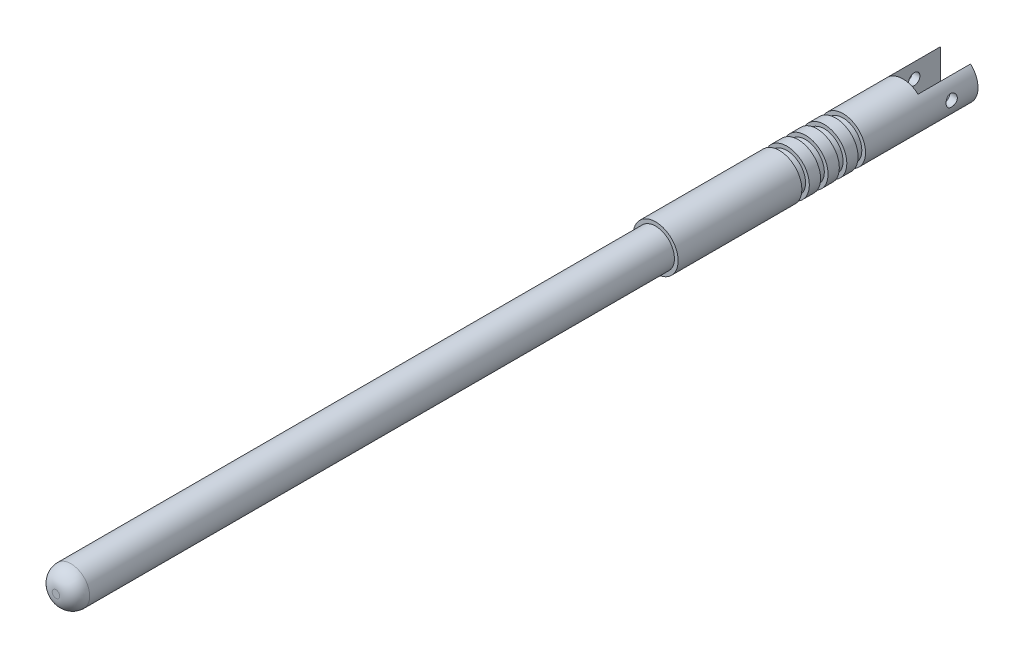
ISO-10303-21;
HEADER;
FILE_DESCRIPTION(('STEP AP214'),'2;1');
FILE_NAME('part.step','',(''),(''),'','','');
FILE_SCHEMA(('AUTOMOTIVE_DESIGN { 1 0 10303 214 1 1 1 1 }'));
ENDSEC;
DATA;
#1=APPLICATION_CONTEXT('core data for automotive mechanical design processes');
#2=APPLICATION_PROTOCOL_DEFINITION('international standard','automotive_design',2000,#1);
#3=PRODUCT_CONTEXT('',#1,'mechanical');
#4=PRODUCT('Part','Part','',(#3));
#5=PRODUCT_RELATED_PRODUCT_CATEGORY('part','',(#4));
#6=PRODUCT_DEFINITION_FORMATION('','',#4);
#7=PRODUCT_DEFINITION_CONTEXT('part definition',#1,'design');
#8=PRODUCT_DEFINITION('design','',#6,#7);
#9=PRODUCT_DEFINITION_SHAPE('','',#8);
#10=(LENGTH_UNIT() NAMED_UNIT(*) SI_UNIT(.MILLI.,.METRE.));
#11=(NAMED_UNIT(*) PLANE_ANGLE_UNIT() SI_UNIT($,.RADIAN.));
#12=(NAMED_UNIT(*) SI_UNIT($,.STERADIAN.) SOLID_ANGLE_UNIT());
#13=UNCERTAINTY_MEASURE_WITH_UNIT(LENGTH_MEASURE(1.E-05),#10,'distance_accuracy_value','');
#14=(GEOMETRIC_REPRESENTATION_CONTEXT(3) GLOBAL_UNCERTAINTY_ASSIGNED_CONTEXT((#13)) GLOBAL_UNIT_ASSIGNED_CONTEXT((#10,
#11,#12)) REPRESENTATION_CONTEXT('',''));
#15=CARTESIAN_POINT('',(0.,0.,0.));
#16=DIRECTION('',(0.,0.,1.));
#17=DIRECTION('',(1.,0.,0.));
#18=AXIS2_PLACEMENT_3D('',#15,#16,#17);
#19=CARTESIAN_POINT('',(0.,0.,15.));
#20=DIRECTION('',(0.,0.,-1.));
#21=DIRECTION('',(-1.,0.,0.));
#22=AXIS2_PLACEMENT_3D('',#19,#20,#21);
#23=CYLINDRICAL_SURFACE('',#22,3.);
#24=CARTESIAN_POINT('',(-3.,0.,4.21187914002249));
#25=CARTESIAN_POINT('',(-2.99999951607766,-0.0396951823118802,4.19871445289056));
#26=CARTESIAN_POINT('',(-2.99920522311729,-0.0782999361684681,4.18221641254789));
#27=CARTESIAN_POINT('',(-2.99636551655052,-0.152202805966226,4.14303785147214));
#28=CARTESIAN_POINT('',(-2.99431920847822,-0.187498537063075,4.1203529171197));
#29=CARTESIAN_POINT('',(-2.9894334418129,-0.253754472537291,4.06948766116593));
#30=CARTESIAN_POINT('',(-2.98659481893473,-0.284719193781647,4.04131313925472));
#31=CARTESIAN_POINT('',(-2.9806338018215,-0.341525636472115,3.98023453489045));
#32=CARTESIAN_POINT('',(-2.97751142685196,-0.367367705345278,3.9473307734438));
#33=CARTESIAN_POINT('',(-2.97145591521927,-0.413521331179031,3.87724707200592));
#34=CARTESIAN_POINT('',(-2.96852555883578,-0.433761410866465,3.8400197705991));
#35=CARTESIAN_POINT('',(-2.963367438778,-0.46770709533146,3.76264994342208));
#36=CARTESIAN_POINT('',(-2.96113964824049,-0.481412949961047,3.72250752918597));
#37=CARTESIAN_POINT('',(-2.95774732100668,-0.501835257590522,3.6406136233411));
#38=CARTESIAN_POINT('',(-2.95657842629934,-0.508580374443533,3.59886947079098));
#39=CARTESIAN_POINT('',(-2.95547262624129,-0.51496852895699,3.51482663466774));
#40=CARTESIAN_POINT('',(-2.95553562108278,-0.514612141981783,3.47252799629658));
#41=CARTESIAN_POINT('',(-2.95687456262065,-0.506860247421461,3.38914488625412));
#42=CARTESIAN_POINT('',(-2.95813512358253,-0.499554026355907,3.34805182036483));
#43=CARTESIAN_POINT('',(-2.96165288461993,-0.478254718260954,3.2676821675055));
#44=CARTESIAN_POINT('',(-2.96391013352712,-0.464261303596828,3.22840566964047));
#45=CARTESIAN_POINT('',(-2.96908763603957,-0.429907281060499,3.152553176333));
#46=CARTESIAN_POINT('',(-2.9720111764563,-0.409514912652045,3.11599180171042));
#47=CARTESIAN_POINT('',(-2.97805573588648,-0.362951099023721,3.04677110845069));
#48=CARTESIAN_POINT('',(-2.98117677390649,-0.336779096984985,3.01411216624746));
#49=CARTESIAN_POINT('',(-2.98714189306465,-0.278990644092407,2.9531916192855));
#50=CARTESIAN_POINT('',(-2.98998194898651,-0.24730921003369,2.9249911938824));
#51=CARTESIAN_POINT('',(-2.99481054742343,-0.179608552433021,2.87429967683179));
#52=CARTESIAN_POINT('',(-2.99679914140029,-0.143589591217036,2.85180824017018));
#53=CARTESIAN_POINT('',(-2.99945068618497,-0.0685144135895478,2.81334503474394));
#54=CARTESIAN_POINT('',(-3.00012338214234,-0.0294827672949382,2.79732604070926));
#55=CARTESIAN_POINT('',(-2.99983908759758,0.0507045205579571,2.77205298123447));
#56=CARTESIAN_POINT('',(-2.99888235921979,0.0918598194530102,2.76279782804239));
#57=CARTESIAN_POINT('',(-2.99521585597383,0.174199035241648,2.75142528371647));
#58=CARTESIAN_POINT('',(-2.99254259684448,0.215364900843016,2.74916479357001));
#59=CARTESIAN_POINT('',(-2.98550950445478,0.297366095055782,2.751384626159));
#60=CARTESIAN_POINT('',(-2.9811496670449,0.338201422853698,2.75586496547913));
#61=CARTESIAN_POINT('',(-2.97094562157494,0.418476634247664,2.77137035636871));
#62=CARTESIAN_POINT('',(-2.96509917227368,0.45791430751371,2.78240532366598));
#63=CARTESIAN_POINT('',(-2.95228814025356,0.534319230666885,2.81064815841938));
#64=CARTESIAN_POINT('',(-2.94532335780499,0.571286037594038,2.82785712920618));
#65=CARTESIAN_POINT('',(-2.93052110778936,0.642984602463689,2.86859472068403));
#66=CARTESIAN_POINT('',(-2.92266290129508,0.677607576322122,2.89230727634627));
#67=CARTESIAN_POINT('',(-2.90687497206096,0.742423474060197,2.94515460022031));
#68=CARTESIAN_POINT('',(-2.89894523384199,0.772615413428582,2.97429057018363));
#69=CARTESIAN_POINT('',(-2.88348375526722,0.82848282456419,3.03806312272153));
#70=CARTESIAN_POINT('',(-2.87596687336067,0.85402687570317,3.07281876818627));
#71=CARTESIAN_POINT('',(-2.86226755404448,0.898875191205323,3.14638793849942));
#72=CARTESIAN_POINT('',(-2.85608489964706,0.9181804704455,3.18520080198889));
#73=CARTESIAN_POINT('',(-2.84582088029416,0.949510762412032,3.26486601253158));
#74=CARTESIAN_POINT('',(-2.84169376949753,0.961695425473673,3.30564946617797));
#75=CARTESIAN_POINT('',(-2.83577921392906,0.979000463604915,3.3888481257989));
#76=CARTESIAN_POINT('',(-2.83399084920814,0.984123616372407,3.43126268341408));
#77=CARTESIAN_POINT('',(-2.83298176289436,0.987023642043795,3.51424381464208));
#78=CARTESIAN_POINT('',(-2.83363729948793,0.9851545363459,3.55479692060054));
#79=CARTESIAN_POINT('',(-2.83717161411528,0.974928694955779,3.63497373825298));
#80=CARTESIAN_POINT('',(-2.84005032040789,0.966572168611042,3.67459747989481));
#81=CARTESIAN_POINT('',(-2.84770153153481,0.943788770588101,3.75144128278852));
#82=CARTESIAN_POINT('',(-2.85245573461855,0.929420483964015,3.78868064602406));
#83=CARTESIAN_POINT('',(-2.8634162309436,0.895081550472223,3.86024615072166));
#84=CARTESIAN_POINT('',(-2.86962282229114,0.875109753302617,3.89457169214097));
#85=CARTESIAN_POINT('',(-2.88324642216272,0.829148540852894,3.96092664813493));
#86=CARTESIAN_POINT('',(-2.89070394739479,0.802937646781916,3.99279428924806));
#87=CARTESIAN_POINT('',(-2.90599263675732,0.745709734301829,4.05177411439199));
#88=CARTESIAN_POINT('',(-2.91382388981771,0.714691567997813,4.07888515932332));
#89=CARTESIAN_POINT('',(-2.92955404998417,0.647268762553988,4.1286806767729));
#90=CARTESIAN_POINT('',(-2.93744306014567,0.610697914790163,4.15114384709847));
#91=CARTESIAN_POINT('',(-2.9523288905426,0.534110527106948,4.18956929348355));
#92=CARTESIAN_POINT('',(-2.95932564938624,0.494093750405726,4.20553112238065));
#93=CARTESIAN_POINT('',(-2.97185920296285,0.412022332668587,4.2303175304511));
#94=CARTESIAN_POINT('',(-2.97740661735805,0.369985350305045,4.23919506443588));
#95=CARTESIAN_POINT('',(-2.98675311750144,0.28484185189493,4.24963800648088));
#96=CARTESIAN_POINT('',(-2.99055368753353,0.241736276775566,4.25120963271876));
#97=CARTESIAN_POINT('',(-2.99564788440698,0.165048435210588,4.24739430441546));
#98=CARTESIAN_POINT('',(-2.9973049259054,0.13141227969311,4.24343153979353));
#99=CARTESIAN_POINT('',(-2.99948115987526,0.0649461717072543,4.23099945842938));
#100=CARTESIAN_POINT('',(-3.00000039152717,0.0321161915167337,4.22253029687737));
#101=CARTESIAN_POINT('',(-3.,0.,4.21187914002249));
#102=B_SPLINE_CURVE_WITH_KNOTS('',3,(#24,#25,#26,#27,#28,#29,#30,#31,#32,#33,#34,#35,#36,#37,
#38,#39,#40,#41,#42,#43,#44,#45,#46,#47,#48,#49,#50,#51,#52,#53,#54,#55,#56,#57,#58,#59,#60,#61,
#62,#63,#64,#65,#66,#67,#68,#69,#70,#71,#72,#73,#74,#75,#76,#77,#78,#79,#80,#81,#82,#83,#84,#85,
#86,#87,#88,#89,#90,#91,#92,#93,#94,#95,#96,#97,#98,#99,#100,#101),.UNSPECIFIED.,.T.,.F.,(4,2,2,
2,2,2,2,2,2,2,2,2,2,2,2,2,2,2,2,2,2,2,2,2,2,2,2,2,2,2,2,2,2,2,2,2,2,2,4),(0.,0.125338767230438,
0.250767183835606,0.376063798248049,0.501351911920008,0.628171767355649,0.754986773135899,
0.881277453768808,1.00755790236335,1.13223759558697,1.25692339803793,1.38223812435334,
1.5075649289549,1.63448495699069,1.76139731297903,1.8873661813037,2.01331478702063,
2.1366690633913,2.2600236432553,2.38356530876347,2.50712906289873,2.6346309553981,
2.76216113420998,2.89287192481439,3.02356144164389,3.15119563345571,3.27877960506184,
3.39999342676328,3.52120333708672,3.64125858946473,3.7613385051236,3.88657206091204,
4.01183556654947,4.14212596794229,4.2724253291991,4.40174133763351,4.53094726292053,
4.63235862420106,4.73376649332777),.UNSPECIFIED.);
#103=CARTESIAN_POINT('',(-3.,0.,4.21187914002249));
#104=VERTEX_POINT('',#103);
#105=EDGE_CURVE('E105',#104,#104,#102,.T.);
#106=ORIENTED_EDGE('',*,*,#105,.T.);
#107=EDGE_LOOP('',(#106));
#108=FACE_BOUND('',#107,.T.);
#109=CARTESIAN_POINT('',(2.99069756244244,0.236067977499789,2.75));
#110=CARTESIAN_POINT('',(2.99393630665962,0.19503062294816,2.75000088477695));
#111=CARTESIAN_POINT('',(2.99632406088275,0.153916140381382,2.75337882080404));
#112=CARTESIAN_POINT('',(2.99939387290241,0.0727255596170461,2.76684667900384));
#113=CARTESIAN_POINT('',(3.00007532111909,0.0326498375765347,2.77693899826876));
#114=CARTESIAN_POINT('',(2.99991139748529,-0.045274253758378,2.80355144445856));
#115=CARTESIAN_POINT('',(2.99906695367447,-0.0831239624472268,2.82006765960908));
#116=CARTESIAN_POINT('',(2.99618332619538,-0.15556848029812,2.85905271339875));
#117=CARTESIAN_POINT('',(2.9941440903337,-0.190163147189995,2.88152181206071));
#118=CARTESIAN_POINT('',(2.98928168526858,-0.255500545505233,2.93203645918274));
#119=CARTESIAN_POINT('',(2.98645089375468,-0.286201378186058,2.96013543485419));
#120=CARTESIAN_POINT('',(2.98051587625903,-0.342533515563384,3.02100079876274));
#121=CARTESIAN_POINT('',(2.97741162223346,-0.368164299445367,3.05376766590916));
#122=CARTESIAN_POINT('',(2.97137692211172,-0.414085719559897,3.12372617916445));
#123=CARTESIAN_POINT('',(2.96845062060682,-0.434271703570968,3.1609869714549));
#124=CARTESIAN_POINT('',(2.96330451373372,-0.468103511267324,3.23841412410749));
#125=CARTESIAN_POINT('',(2.96108467740944,-0.481749621531802,3.27858035706357));
#126=CARTESIAN_POINT('',(2.95771105786448,-0.502047632151077,3.36050618248677));
#127=CARTESIAN_POINT('',(2.9565527711905,-0.508729095643278,3.40225825397426));
#128=CARTESIAN_POINT('',(2.95546883314705,-0.514989887097744,3.48630564199189));
#129=CARTESIAN_POINT('',(2.95554307754874,-0.514569815600421,3.52860091228423));
#130=CARTESIAN_POINT('',(2.95690326674875,-0.506693249755723,3.61196808234772));
#131=CARTESIAN_POINT('',(2.95817388402123,-0.499325761577035,3.65304868799473));
#132=CARTESIAN_POINT('',(2.96170920939307,-0.477907149936521,3.73338356843314));
#133=CARTESIAN_POINT('',(2.96397396902301,-0.463855680012732,3.77263774843656));
#134=CARTESIAN_POINT('',(2.96916305654992,-0.429388422832689,3.84843981891194));
#135=CARTESIAN_POINT('',(2.97209071007114,-0.408940340383742,3.88497278505468));
#136=CARTESIAN_POINT('',(2.97813907237946,-0.362270095614246,3.95412777628841));
#137=CARTESIAN_POINT('',(2.98125979952838,-0.33604738350207,3.98674942853351));
#138=CARTESIAN_POINT('',(2.98721941321197,-0.278164283096547,4.04758568077872));
#139=CARTESIAN_POINT('',(2.99005422594272,-0.246439183606034,4.07573917891916));
#140=CARTESIAN_POINT('',(2.9948677583643,-0.178659443487224,4.12632991424384));
#141=CARTESIAN_POINT('',(2.99684653034378,-0.142605067471574,4.14876750053278));
#142=CARTESIAN_POINT('',(2.99947461066354,-0.0674732045516595,4.18711567307646));
#143=CARTESIAN_POINT('',(3.00013383807447,-0.0284205819936907,4.20307423258931));
#144=CARTESIAN_POINT('',(2.99982062168798,0.0517975336617581,4.22822425378961));
#145=CARTESIAN_POINT('',(2.99884844005921,0.0929626862435434,4.23741680243855));
#146=CARTESIAN_POINT('',(2.99515105661623,0.175310979678907,4.24866559713729));
#147=CARTESIAN_POINT('',(2.99246234095656,0.216476318024441,4.25086480453124));
#148=CARTESIAN_POINT('',(2.98539968111012,0.298466052670951,4.24852427465946));
#149=CARTESIAN_POINT('',(2.98102573114819,0.33929044780305,4.24398451429962));
#150=CARTESIAN_POINT('',(2.97079545426362,0.419540617004002,4.22836256436016));
#151=CARTESIAN_POINT('',(2.96493666188617,0.458963939341217,4.21726945231784));
#152=CARTESIAN_POINT('',(2.95210459158009,0.53533119065314,4.18891325141342));
#153=CARTESIAN_POINT('',(2.94513111397027,0.572274673710418,4.1716490563967));
#154=CARTESIAN_POINT('',(2.93031533294872,0.64392038683909,4.13080160530971));
#155=CARTESIAN_POINT('',(2.92245238918688,0.678513297866016,4.10703407969236));
#156=CARTESIAN_POINT('',(2.90666071992588,0.743260369814846,4.0540809942509));
#157=CARTESIAN_POINT('',(2.89873198024063,0.773413545770085,4.02489423539351));
#158=CARTESIAN_POINT('',(2.88328004742477,0.82918980067454,3.9610289506616));
#159=CARTESIAN_POINT('',(2.87577178208263,0.854682035017659,3.92623221167625));
#160=CARTESIAN_POINT('',(2.86209597494815,0.899419901259911,3.85258947725756));
#161=CARTESIAN_POINT('',(2.85592821095619,0.918666568676635,3.81374415449361));
#162=CARTESIAN_POINT('',(2.84570003141278,0.949871750893736,3.73403454054329));
#163=CARTESIAN_POINT('',(2.84159330020445,0.961991607702354,3.69323956928203));
#164=CARTESIAN_POINT('',(2.83572149819913,0.979166987422673,3.61003008643096));
#165=CARTESIAN_POINT('',(2.83395551256457,0.984225270262522,3.56761621423075));
#166=CARTESIAN_POINT('',(2.83298947472051,0.987001406788516,3.48464684842205));
#167=CARTESIAN_POINT('',(2.8336657977492,0.985072901242804,3.44410421481021));
#168=CARTESIAN_POINT('',(2.83723917496324,0.974732394782071,3.3639584730545));
#169=CARTESIAN_POINT('',(2.84013615804815,0.966320601446982,3.324355334872));
#170=CARTESIAN_POINT('',(2.8478207511757,0.943429707976077,3.24754994170407));
#171=CARTESIAN_POINT('',(2.85259063759159,0.929007410006668,3.21032887785913));
#172=CARTESIAN_POINT('',(2.86357826489319,0.894564107378878,3.13880867812077));
#173=CARTESIAN_POINT('',(2.86979628510538,0.874542022443337,3.10451010768449));
#174=CARTESIAN_POINT('',(2.88343883880841,0.828480730593314,3.03821480596159));
#175=CARTESIAN_POINT('',(2.89090375745372,0.802219794183629,3.00638048903686));
#176=CARTESIAN_POINT('',(2.90620263636258,0.744892825489461,2.9474717341458));
#177=CARTESIAN_POINT('',(2.91403672533085,0.713825108657029,2.92039897201257));
#178=CARTESIAN_POINT('',(2.92976774713608,0.646303939480038,2.87068788914522));
#179=CARTESIAN_POINT('',(2.93765451802537,0.609684044450186,2.8482719107454));
#180=CARTESIAN_POINT('',(2.95252548958293,0.53302304109773,2.80996269954897));
#181=CARTESIAN_POINT('',(2.95951020114433,0.49298389085239,2.79406576341032));
#182=CARTESIAN_POINT('',(2.97108738750211,0.416990437759085,2.77124200443547));
#183=CARTESIAN_POINT('',(2.97588291574056,0.381367312582405,2.76330558148212));
#184=CARTESIAN_POINT('',(2.98424365716021,0.309205808260737,2.75268457868788));
#185=CARTESIAN_POINT('',(2.98780905486189,0.272667567266496,2.74999921090251));
#186=CARTESIAN_POINT('',(2.99069756244244,0.236067977499789,2.75));
#187=B_SPLINE_CURVE_WITH_KNOTS('',3,(#109,#110,#111,#112,#113,#114,#115,#116,#117,#118,#119,
#120,#121,#122,#123,#124,#125,#126,#127,#128,#129,#130,#131,#132,#133,#134,#135,#136,#137,#138,
#139,#140,#141,#142,#143,#144,#145,#146,#147,#148,#149,#150,#151,#152,#153,#154,#155,#156,#157,
#158,#159,#160,#161,#162,#163,#164,#165,#166,#167,#168,#169,#170,#171,#172,#173,#174,#175,#176,
#177,#178,#179,#180,#181,#182,#183,#184,#185,#186),.UNSPECIFIED.,.T.,.F.,(4,2,2,2,2,2,2,2,2,2,2,
2,2,2,2,2,2,2,2,2,2,2,2,2,2,2,2,2,2,2,2,2,2,2,2,2,2,2,4),(0.,0.123363701901307,0.24677146934905,
0.370104206090382,0.493442330911974,0.618011663022439,0.742593784726557,0.869422863488141,
0.996246384053896,1.12252935158483,1.24880164006594,1.37347787066641,1.49816056452203,
1.62348320203825,1.74881777644962,1.87574100539723,2.00265648052916,2.12861428923167,
2.25455185835828,2.37789782582978,2.50124421600277,2.62479676976392,2.74837148119522,
2.8758943781183,3.00344552383418,3.13415893861064,3.26485066996219,3.39245682208083,
3.52001308694992,3.64120525468809,3.76239354229354,3.88246162025464,4.00255287702174,
4.12780845164633,4.25310802223932,4.3834508342647,4.51371949813763,4.62375920683571,
4.73378240231265),.UNSPECIFIED.);
#188=CARTESIAN_POINT('',(2.99069756244244,0.236067977499789,2.75));
#189=VERTEX_POINT('',#188);
#190=EDGE_CURVE('E180',#189,#189,#187,.T.);
#191=ORIENTED_EDGE('',*,*,#190,.T.);
#192=EDGE_LOOP('',(#191));
#193=FACE_BOUND('',#192,.T.);
#194=CARTESIAN_POINT('',(0.,0.,15.));
#195=DIRECTION('',(0.,0.,1.));
#196=DIRECTION('',(1.,0.,0.));
#197=AXIS2_PLACEMENT_3D('',#194,#195,#196);
#198=CIRCLE('',#197,3.);
#199=CARTESIAN_POINT('',(3.,0.,15.));
#200=VERTEX_POINT('',#199);
#201=EDGE_CURVE('E111',#200,#200,#198,.T.);
#202=ORIENTED_EDGE('',*,*,#201,.F.);
#203=EDGE_LOOP('',(#202));
#204=FACE_BOUND('',#203,.T.);
#205=CARTESIAN_POINT('',(0.,0.,7.));
#206=DIRECTION('',(0.,0.,-1.));
#207=DIRECTION('',(-1.,0.,0.));
#208=AXIS2_PLACEMENT_3D('',#205,#206,#207);
#209=CIRCLE('',#208,3.);
#210=CARTESIAN_POINT('',(-2.,2.23606797749979,7.));
#211=VERTEX_POINT('',#210);
#212=CARTESIAN_POINT('',(2.,2.23606797749979,7.));
#213=VERTEX_POINT('',#212);
#214=EDGE_CURVE('E86',#211,#213,#209,.T.);
#215=ORIENTED_EDGE('',*,*,#214,.F.);
#216=DIRECTION('',(0.,0.,-1.));
#217=VECTOR('',#216,1.);
#218=CARTESIAN_POINT('',(-2.,2.23606797749979,15.));
#219=LINE('',#218,#217);
#220=CARTESIAN_POINT('',(-2.,2.23606797749979,0.));
#221=VERTEX_POINT('',#220);
#222=EDGE_CURVE('E61',#211,#221,#219,.T.);
#223=ORIENTED_EDGE('',*,*,#222,.T.);
#224=CARTESIAN_POINT('',(0.,0.,0.));
#225=DIRECTION('',(0.,0.,1.));
#226=DIRECTION('',(1.,0.,0.));
#227=AXIS2_PLACEMENT_3D('',#224,#225,#226);
#228=CIRCLE('',#227,3.);
#229=CARTESIAN_POINT('',(2.,2.23606797749979,0.));
#230=VERTEX_POINT('',#229);
#231=EDGE_CURVE('E110',#221,#230,#228,.T.);
#232=ORIENTED_EDGE('',*,*,#231,.T.);
#233=DIRECTION('',(0.,0.,-1.));
#234=VECTOR('',#233,1.);
#235=CARTESIAN_POINT('',(2.,2.23606797749979,15.));
#236=LINE('',#235,#234);
#237=EDGE_CURVE('E53',#230,#213,#236,.F.);
#238=ORIENTED_EDGE('',*,*,#237,.T.);
#239=EDGE_LOOP('',(#215,#223,#232,#238));
#240=FACE_BOUND('',#239,.T.);
#241=ADVANCED_FACE('F38',(#108,#193,#204,#240),#23,.T.);
#242=CARTESIAN_POINT('',(0.,0.,15.));
#243=DIRECTION('',(0.,0.,1.));
#244=DIRECTION('',(1.,0.,0.));
#245=AXIS2_PLACEMENT_3D('',#242,#243,#244);
#246=PLANE('',#245);
#247=CARTESIAN_POINT('',(0.,0.,15.));
#248=DIRECTION('',(0.,0.,1.));
#249=DIRECTION('',(1.,0.,0.));
#250=AXIS2_PLACEMENT_3D('',#247,#248,#249);
#251=CIRCLE('',#250,2.5);
#252=CARTESIAN_POINT('',(2.5,0.,15.));
#253=VERTEX_POINT('',#252);
#254=EDGE_CURVE('E118',#253,#253,#251,.T.);
#255=ORIENTED_EDGE('',*,*,#254,.F.);
#256=EDGE_LOOP('',(#255));
#257=FACE_BOUND('',#256,.T.);
#258=ORIENTED_EDGE('',*,*,#201,.T.);
#259=EDGE_LOOP('',(#258));
#260=FACE_BOUND('',#259,.T.);
#261=ADVANCED_FACE('F214',(#257,#260),#246,.T.);
#262=CARTESIAN_POINT('',(0.,0.,0.));
#263=DIRECTION('',(0.,0.,1.));
#264=DIRECTION('',(1.,0.,0.));
#265=AXIS2_PLACEMENT_3D('',#262,#263,#264);
#266=PLANE('',#265);
#267=ORIENTED_EDGE('',*,*,#231,.F.);
#268=DIRECTION('',(0.,1.,0.));
#269=VECTOR('',#268,1.);
#270=CARTESIAN_POINT('',(-2.,-2.,0.));
#271=LINE('',#270,#269);
#272=CARTESIAN_POINT('',(-2.,-2.,0.));
#273=VERTEX_POINT('',#272);
#274=EDGE_CURVE('E102',#273,#221,#271,.T.);
#275=ORIENTED_EDGE('',*,*,#274,.F.);
#276=DIRECTION('',(-1.,0.,0.));
#277=VECTOR('',#276,1.);
#278=CARTESIAN_POINT('',(2.,-2.,0.));
#279=LINE('',#278,#277);
#280=CARTESIAN_POINT('',(2.,-2.,0.));
#281=VERTEX_POINT('',#280);
#282=EDGE_CURVE('E104',#281,#273,#279,.T.);
#283=ORIENTED_EDGE('',*,*,#282,.F.);
#284=DIRECTION('',(0.,1.,0.));
#285=VECTOR('',#284,1.);
#286=CARTESIAN_POINT('',(2.,0.,0.));
#287=LINE('',#286,#285);
#288=EDGE_CURVE('E92',#281,#230,#287,.T.);
#289=ORIENTED_EDGE('',*,*,#288,.T.);
#290=EDGE_LOOP('',(#267,#275,#283,#289));
#291=FACE_BOUND('',#290,.T.);
#292=ADVANCED_FACE('F205',(#291),#266,.F.);
#293=CARTESIAN_POINT('',(0.,0.,7.));
#294=DIRECTION('',(0.,0.,-1.));
#295=DIRECTION('',(-1.,0.,0.));
#296=AXIS2_PLACEMENT_3D('',#293,#294,#295);
#297=PLANE('',#296);
#298=ORIENTED_EDGE('',*,*,#214,.T.);
#299=DIRECTION('',(0.,-1.,0.));
#300=VECTOR('',#299,1.);
#301=CARTESIAN_POINT('',(2.,3.18320258421781,7.));
#302=LINE('',#301,#300);
#303=CARTESIAN_POINT('',(2.,-2.,7.));
#304=VERTEX_POINT('',#303);
#305=EDGE_CURVE('E80',#213,#304,#302,.T.);
#306=ORIENTED_EDGE('',*,*,#305,.T.);
#307=DIRECTION('',(-1.,0.,0.));
#308=VECTOR('',#307,1.);
#309=CARTESIAN_POINT('',(2.,-2.,7.));
#310=LINE('',#309,#308);
#311=CARTESIAN_POINT('',(-2.,-2.,7.));
#312=VERTEX_POINT('',#311);
#313=EDGE_CURVE('E84',#304,#312,#310,.T.);
#314=ORIENTED_EDGE('',*,*,#313,.T.);
#315=DIRECTION('',(0.,1.,0.));
#316=VECTOR('',#315,1.);
#317=CARTESIAN_POINT('',(-2.,-2.,7.));
#318=LINE('',#317,#316);
#319=EDGE_CURVE('E87',#312,#211,#318,.T.);
#320=ORIENTED_EDGE('',*,*,#319,.T.);
#321=EDGE_LOOP('',(#298,#306,#314,#320));
#322=FACE_BOUND('',#321,.T.);
#323=ADVANCED_FACE('F82',(#322),#297,.T.);
#324=CARTESIAN_POINT('',(-2.,-2.,7.));
#325=DIRECTION('',(-1.,0.,0.));
#326=DIRECTION('',(0.,0.,1.));
#327=AXIS2_PLACEMENT_3D('',#324,#325,#326);
#328=PLANE('',#327);
#329=CARTESIAN_POINT('',(-2.,0.236067977499789,3.5));
#330=DIRECTION('',(-1.,0.,0.));
#331=DIRECTION('',(0.,0.,1.));
#332=AXIS2_PLACEMENT_3D('',#329,#330,#331);
#333=CIRCLE('',#332,0.75);
#334=CARTESIAN_POINT('',(-2.,0.236067977499789,4.25));
#335=VERTEX_POINT('',#334);
#336=EDGE_CURVE('E121',#335,#335,#333,.T.);
#337=ORIENTED_EDGE('',*,*,#336,.T.);
#338=EDGE_LOOP('',(#337));
#339=FACE_BOUND('',#338,.T.);
#340=ORIENTED_EDGE('',*,*,#319,.F.);
#341=DIRECTION('',(0.,0.,-1.));
#342=VECTOR('',#341,1.);
#343=CARTESIAN_POINT('',(-2.,-2.,7.));
#344=LINE('',#343,#342);
#345=EDGE_CURVE('E96',#312,#273,#344,.T.);
#346=ORIENTED_EDGE('',*,*,#345,.T.);
#347=ORIENTED_EDGE('',*,*,#274,.T.);
#348=ORIENTED_EDGE('',*,*,#222,.F.);
#349=EDGE_LOOP('',(#340,#346,#347,#348));
#350=FACE_BOUND('',#349,.T.);
#351=ADVANCED_FACE('F204',(#339,#350),#328,.F.);
#352=CARTESIAN_POINT('',(2.,3.18320258421781,7.));
#353=DIRECTION('',(1.,0.,0.));
#354=DIRECTION('',(0.,1.,0.));
#355=AXIS2_PLACEMENT_3D('',#352,#353,#354);
#356=PLANE('',#355);
#357=CARTESIAN_POINT('',(2.,0.236067977499789,3.5));
#358=DIRECTION('',(1.,0.,0.));
#359=DIRECTION('',(0.,1.,0.));
#360=AXIS2_PLACEMENT_3D('',#357,#358,#359);
#361=CIRCLE('',#360,0.75);
#362=CARTESIAN_POINT('',(2.,0.986067977499789,3.5));
#363=VERTEX_POINT('',#362);
#364=EDGE_CURVE('E119',#363,#363,#361,.T.);
#365=ORIENTED_EDGE('',*,*,#364,.T.);
#366=EDGE_LOOP('',(#365));
#367=FACE_BOUND('',#366,.T.);
#368=ORIENTED_EDGE('',*,*,#288,.F.);
#369=DIRECTION('',(0.,0.,-1.));
#370=VECTOR('',#369,1.);
#371=CARTESIAN_POINT('',(2.,-2.,7.));
#372=LINE('',#371,#370);
#373=EDGE_CURVE('E90',#304,#281,#372,.T.);
#374=ORIENTED_EDGE('',*,*,#373,.F.);
#375=ORIENTED_EDGE('',*,*,#305,.F.);
#376=ORIENTED_EDGE('',*,*,#237,.F.);
#377=EDGE_LOOP('',(#368,#374,#375,#376));
#378=FACE_BOUND('',#377,.T.);
#379=ADVANCED_FACE('F91',(#367,#378),#356,.F.);
#380=CARTESIAN_POINT('',(2.,-2.,7.));
#381=DIRECTION('',(0.,-1.,0.));
#382=DIRECTION('',(0.,0.,-1.));
#383=AXIS2_PLACEMENT_3D('',#380,#381,#382);
#384=PLANE('',#383);
#385=ORIENTED_EDGE('',*,*,#282,.T.);
#386=ORIENTED_EDGE('',*,*,#345,.F.);
#387=ORIENTED_EDGE('',*,*,#313,.F.);
#388=ORIENTED_EDGE('',*,*,#373,.T.);
#389=EDGE_LOOP('',(#385,#386,#387,#388));
#390=FACE_BOUND('',#389,.T.);
#391=ADVANCED_FACE('F98',(#390),#384,.F.);
#392=CARTESIAN_POINT('',(-5.,0.236067977499789,3.5));
#393=DIRECTION('',(1.,0.,0.));
#394=DIRECTION('',(0.,0.,-1.));
#395=AXIS2_PLACEMENT_3D('',#392,#393,#394);
#396=CYLINDRICAL_SURFACE('',#395,0.75);
#397=ORIENTED_EDGE('',*,*,#364,.F.);
#398=EDGE_LOOP('',(#397));
#399=FACE_BOUND('',#398,.T.);
#400=ORIENTED_EDGE('',*,*,#190,.F.);
#401=EDGE_LOOP('',(#400));
#402=FACE_BOUND('',#401,.T.);
#403=ADVANCED_FACE('F198',(#399,#402),#396,.F.);
#404=ORIENTED_EDGE('',*,*,#336,.F.);
#405=EDGE_LOOP('',(#404));
#406=FACE_BOUND('',#405,.T.);
#407=ORIENTED_EDGE('',*,*,#105,.F.);
#408=EDGE_LOOP('',(#407));
#409=FACE_BOUND('',#408,.T.);
#410=ADVANCED_FACE('F192',(#406,#409),#396,.F.);
#411=CARTESIAN_POINT('',(0.,0.,16.));
#412=DIRECTION('',(0.,0.,-1.));
#413=DIRECTION('',(-1.,0.,0.));
#414=AXIS2_PLACEMENT_3D('',#411,#412,#413);
#415=CYLINDRICAL_SURFACE('',#414,2.5);
#416=CARTESIAN_POINT('',(0.,0.,16.));
#417=DIRECTION('',(0.,0.,1.));
#418=DIRECTION('',(1.,0.,0.));
#419=AXIS2_PLACEMENT_3D('',#416,#417,#418);
#420=CIRCLE('',#419,2.5);
#421=CARTESIAN_POINT('',(2.5,0.,16.));
#422=VERTEX_POINT('',#421);
#423=EDGE_CURVE('E122',#422,#422,#420,.T.);
#424=ORIENTED_EDGE('',*,*,#423,.F.);
#425=EDGE_LOOP('',(#424));
#426=FACE_BOUND('',#425,.T.);
#427=ORIENTED_EDGE('',*,*,#254,.T.);
#428=EDGE_LOOP('',(#427));
#429=FACE_BOUND('',#428,.T.);
#430=ADVANCED_FACE('F197',(#426,#429),#415,.T.);
#431=CARTESIAN_POINT('',(0.,0.,17.5));
#432=DIRECTION('',(0.,0.,-1.));
#433=DIRECTION('',(-1.,0.,0.));
#434=AXIS2_PLACEMENT_3D('',#431,#432,#433);
#435=CYLINDRICAL_SURFACE('',#434,3.);
#436=CARTESIAN_POINT('',(0.,0.,17.5));
#437=DIRECTION('',(0.,0.,1.));
#438=DIRECTION('',(1.,0.,0.));
#439=AXIS2_PLACEMENT_3D('',#436,#437,#438);
#440=CIRCLE('',#439,3.);
#441=CARTESIAN_POINT('',(3.,0.,17.5));
#442=VERTEX_POINT('',#441);
#443=EDGE_CURVE('E169',#442,#442,#440,.T.);
#444=ORIENTED_EDGE('',*,*,#443,.F.);
#445=EDGE_LOOP('',(#444));
#446=FACE_BOUND('',#445,.T.);
#447=CARTESIAN_POINT('',(0.,0.,16.));
#448=DIRECTION('',(0.,0.,1.));
#449=DIRECTION('',(1.,0.,0.));
#450=AXIS2_PLACEMENT_3D('',#447,#448,#449);
#451=CIRCLE('',#450,3.);
#452=CARTESIAN_POINT('',(3.,0.,16.));
#453=VERTEX_POINT('',#452);
#454=EDGE_CURVE('E166',#453,#453,#451,.T.);
#455=ORIENTED_EDGE('',*,*,#454,.T.);
#456=EDGE_LOOP('',(#455));
#457=FACE_BOUND('',#456,.T.);
#458=ADVANCED_FACE('F255',(#446,#457),#435,.T.);
#459=CARTESIAN_POINT('',(0.,0.,17.5));
#460=DIRECTION('',(0.,0.,1.));
#461=DIRECTION('',(1.,0.,0.));
#462=AXIS2_PLACEMENT_3D('',#459,#460,#461);
#463=PLANE('',#462);
#464=CARTESIAN_POINT('',(0.,0.,17.5));
#465=DIRECTION('',(0.,0.,1.));
#466=DIRECTION('',(1.,0.,0.));
#467=AXIS2_PLACEMENT_3D('',#464,#465,#466);
#468=CIRCLE('',#467,2.5);
#469=CARTESIAN_POINT('',(2.5,0.,17.5));
#470=VERTEX_POINT('',#469);
#471=EDGE_CURVE('E157',#470,#470,#468,.T.);
#472=ORIENTED_EDGE('',*,*,#471,.F.);
#473=EDGE_LOOP('',(#472));
#474=FACE_BOUND('',#473,.T.);
#475=ORIENTED_EDGE('',*,*,#443,.T.);
#476=EDGE_LOOP('',(#475));
#477=FACE_BOUND('',#476,.T.);
#478=ADVANCED_FACE('F263',(#474,#477),#463,.T.);
#479=CARTESIAN_POINT('',(0.,0.,16.));
#480=DIRECTION('',(0.,0.,1.));
#481=DIRECTION('',(1.,0.,0.));
#482=AXIS2_PLACEMENT_3D('',#479,#480,#481);
#483=PLANE('',#482);
#484=ORIENTED_EDGE('',*,*,#423,.T.);
#485=EDGE_LOOP('',(#484));
#486=FACE_BOUND('',#485,.T.);
#487=ORIENTED_EDGE('',*,*,#454,.F.);
#488=EDGE_LOOP('',(#487));
#489=FACE_BOUND('',#488,.T.);
#490=ADVANCED_FACE('F272',(#486,#489),#483,.F.);
#491=CARTESIAN_POINT('',(0.,0.,18.5));
#492=DIRECTION('',(0.,0.,-1.));
#493=DIRECTION('',(-1.,0.,0.));
#494=AXIS2_PLACEMENT_3D('',#491,#492,#493);
#495=CYLINDRICAL_SURFACE('',#494,2.5);
#496=CARTESIAN_POINT('',(0.,0.,18.5));
#497=DIRECTION('',(0.,0.,1.));
#498=DIRECTION('',(1.,0.,0.));
#499=AXIS2_PLACEMENT_3D('',#496,#497,#498);
#500=CIRCLE('',#499,2.5);
#501=CARTESIAN_POINT('',(2.5,0.,18.5));
#502=VERTEX_POINT('',#501);
#503=EDGE_CURVE('E161',#502,#502,#500,.T.);
#504=ORIENTED_EDGE('',*,*,#503,.F.);
#505=EDGE_LOOP('',(#504));
#506=FACE_BOUND('',#505,.T.);
#507=ORIENTED_EDGE('',*,*,#471,.T.);
#508=EDGE_LOOP('',(#507));
#509=FACE_BOUND('',#508,.T.);
#510=ADVANCED_FACE('F282',(#506,#509),#495,.T.);
#511=CARTESIAN_POINT('',(0.,0.,20.));
#512=DIRECTION('',(0.,0.,-1.));
#513=DIRECTION('',(-1.,0.,0.));
#514=AXIS2_PLACEMENT_3D('',#511,#512,#513);
#515=CYLINDRICAL_SURFACE('',#514,3.);
#516=CARTESIAN_POINT('',(0.,0.,20.));
#517=DIRECTION('',(0.,0.,1.));
#518=DIRECTION('',(1.,0.,0.));
#519=AXIS2_PLACEMENT_3D('',#516,#517,#518);
#520=CIRCLE('',#519,3.);
#521=CARTESIAN_POINT('',(3.,0.,20.));
#522=VERTEX_POINT('',#521);
#523=EDGE_CURVE('E158',#522,#522,#520,.T.);
#524=ORIENTED_EDGE('',*,*,#523,.F.);
#525=EDGE_LOOP('',(#524));
#526=FACE_BOUND('',#525,.T.);
#527=CARTESIAN_POINT('',(0.,0.,18.5));
#528=DIRECTION('',(0.,0.,1.));
#529=DIRECTION('',(1.,0.,0.));
#530=AXIS2_PLACEMENT_3D('',#527,#528,#529);
#531=CIRCLE('',#530,3.);
#532=CARTESIAN_POINT('',(3.,0.,18.5));
#533=VERTEX_POINT('',#532);
#534=EDGE_CURVE('E154',#533,#533,#531,.T.);
#535=ORIENTED_EDGE('',*,*,#534,.T.);
#536=EDGE_LOOP('',(#535));
#537=FACE_BOUND('',#536,.T.);
#538=ADVANCED_FACE('F290',(#526,#537),#515,.T.);
#539=CARTESIAN_POINT('',(0.,0.,20.));
#540=DIRECTION('',(0.,0.,1.));
#541=DIRECTION('',(1.,0.,0.));
#542=AXIS2_PLACEMENT_3D('',#539,#540,#541);
#543=PLANE('',#542);
#544=CARTESIAN_POINT('',(0.,0.,20.));
#545=DIRECTION('',(0.,0.,1.));
#546=DIRECTION('',(1.,0.,0.));
#547=AXIS2_PLACEMENT_3D('',#544,#545,#546);
#548=CIRCLE('',#547,2.5);
#549=CARTESIAN_POINT('',(2.5,0.,20.));
#550=VERTEX_POINT('',#549);
#551=EDGE_CURVE('E133',#550,#550,#548,.T.);
#552=ORIENTED_EDGE('',*,*,#551,.F.);
#553=EDGE_LOOP('',(#552));
#554=FACE_BOUND('',#553,.T.);
#555=ORIENTED_EDGE('',*,*,#523,.T.);
#556=EDGE_LOOP('',(#555));
#557=FACE_BOUND('',#556,.T.);
#558=ADVANCED_FACE('F298',(#554,#557),#543,.T.);
#559=CARTESIAN_POINT('',(0.,0.,18.5));
#560=DIRECTION('',(0.,0.,1.));
#561=DIRECTION('',(1.,0.,0.));
#562=AXIS2_PLACEMENT_3D('',#559,#560,#561);
#563=PLANE('',#562);
#564=ORIENTED_EDGE('',*,*,#503,.T.);
#565=EDGE_LOOP('',(#564));
#566=FACE_BOUND('',#565,.T.);
#567=ORIENTED_EDGE('',*,*,#534,.F.);
#568=EDGE_LOOP('',(#567));
#569=FACE_BOUND('',#568,.T.);
#570=ADVANCED_FACE('F307',(#566,#569),#563,.F.);
#571=CARTESIAN_POINT('',(0.,0.,21.));
#572=DIRECTION('',(0.,0.,-1.));
#573=DIRECTION('',(-1.,0.,0.));
#574=AXIS2_PLACEMENT_3D('',#571,#572,#573);
#575=CYLINDRICAL_SURFACE('',#574,2.5);
#576=CARTESIAN_POINT('',(0.,0.,21.));
#577=DIRECTION('',(0.,0.,1.));
#578=DIRECTION('',(1.,0.,0.));
#579=AXIS2_PLACEMENT_3D('',#576,#577,#578);
#580=CIRCLE('',#579,2.5);
#581=CARTESIAN_POINT('',(2.5,0.,21.));
#582=VERTEX_POINT('',#581);
#583=EDGE_CURVE('E149',#582,#582,#580,.T.);
#584=ORIENTED_EDGE('',*,*,#583,.F.);
#585=EDGE_LOOP('',(#584));
#586=FACE_BOUND('',#585,.T.);
#587=ORIENTED_EDGE('',*,*,#551,.T.);
#588=EDGE_LOOP('',(#587));
#589=FACE_BOUND('',#588,.T.);
#590=ADVANCED_FACE('F315',(#586,#589),#575,.T.);
#591=CARTESIAN_POINT('',(0.,0.,22.5));
#592=DIRECTION('',(0.,0.,-1.));
#593=DIRECTION('',(-1.,0.,0.));
#594=AXIS2_PLACEMENT_3D('',#591,#592,#593);
#595=CYLINDRICAL_SURFACE('',#594,3.);
#596=CARTESIAN_POINT('',(0.,0.,22.5));
#597=DIRECTION('',(0.,0.,1.));
#598=DIRECTION('',(1.,0.,0.));
#599=AXIS2_PLACEMENT_3D('',#596,#597,#598);
#600=CIRCLE('',#599,3.);
#601=CARTESIAN_POINT('',(3.,0.,22.5));
#602=VERTEX_POINT('',#601);
#603=EDGE_CURVE('E146',#602,#602,#600,.T.);
#604=ORIENTED_EDGE('',*,*,#603,.F.);
#605=EDGE_LOOP('',(#604));
#606=FACE_BOUND('',#605,.T.);
#607=CARTESIAN_POINT('',(0.,0.,21.));
#608=DIRECTION('',(0.,0.,1.));
#609=DIRECTION('',(1.,0.,0.));
#610=AXIS2_PLACEMENT_3D('',#607,#608,#609);
#611=CIRCLE('',#610,3.);
#612=CARTESIAN_POINT('',(3.,0.,21.));
#613=VERTEX_POINT('',#612);
#614=EDGE_CURVE('E144',#613,#613,#611,.T.);
#615=ORIENTED_EDGE('',*,*,#614,.T.);
#616=EDGE_LOOP('',(#615));
#617=FACE_BOUND('',#616,.T.);
#618=ADVANCED_FACE('F323',(#606,#617),#595,.T.);
#619=CARTESIAN_POINT('',(0.,0.,22.5));
#620=DIRECTION('',(0.,0.,1.));
#621=DIRECTION('',(1.,0.,0.));
#622=AXIS2_PLACEMENT_3D('',#619,#620,#621);
#623=PLANE('',#622);
#624=CARTESIAN_POINT('',(0.,0.,22.5));
#625=DIRECTION('',(0.,0.,1.));
#626=DIRECTION('',(1.,0.,0.));
#627=AXIS2_PLACEMENT_3D('',#624,#625,#626);
#628=CIRCLE('',#627,2.5);
#629=CARTESIAN_POINT('',(2.5,0.,22.5));
#630=VERTEX_POINT('',#629);
#631=EDGE_CURVE('E128',#630,#630,#628,.T.);
#632=ORIENTED_EDGE('',*,*,#631,.F.);
#633=EDGE_LOOP('',(#632));
#634=FACE_BOUND('',#633,.T.);
#635=ORIENTED_EDGE('',*,*,#603,.T.);
#636=EDGE_LOOP('',(#635));
#637=FACE_BOUND('',#636,.T.);
#638=ADVANCED_FACE('F331',(#634,#637),#623,.T.);
#639=CARTESIAN_POINT('',(0.,0.,21.));
#640=DIRECTION('',(0.,0.,1.));
#641=DIRECTION('',(1.,0.,0.));
#642=AXIS2_PLACEMENT_3D('',#639,#640,#641);
#643=PLANE('',#642);
#644=ORIENTED_EDGE('',*,*,#583,.T.);
#645=EDGE_LOOP('',(#644));
#646=FACE_BOUND('',#645,.T.);
#647=ORIENTED_EDGE('',*,*,#614,.F.);
#648=EDGE_LOOP('',(#647));
#649=FACE_BOUND('',#648,.T.);
#650=ADVANCED_FACE('F339',(#646,#649),#643,.F.);
#651=CARTESIAN_POINT('',(0.,0.,23.5));
#652=DIRECTION('',(0.,0.,-1.));
#653=DIRECTION('',(-1.,0.,0.));
#654=AXIS2_PLACEMENT_3D('',#651,#652,#653);
#655=CYLINDRICAL_SURFACE('',#654,2.5);
#656=CARTESIAN_POINT('',(0.,0.,23.5));
#657=DIRECTION('',(0.,0.,1.));
#658=DIRECTION('',(1.,0.,0.));
#659=AXIS2_PLACEMENT_3D('',#656,#657,#658);
#660=CIRCLE('',#659,2.5);
#661=CARTESIAN_POINT('',(2.5,0.,23.5));
#662=VERTEX_POINT('',#661);
#663=EDGE_CURVE('E139',#662,#662,#660,.T.);
#664=ORIENTED_EDGE('',*,*,#663,.F.);
#665=EDGE_LOOP('',(#664));
#666=FACE_BOUND('',#665,.T.);
#667=ORIENTED_EDGE('',*,*,#631,.T.);
#668=EDGE_LOOP('',(#667));
#669=FACE_BOUND('',#668,.T.);
#670=ADVANCED_FACE('F346',(#666,#669),#655,.T.);
#671=CARTESIAN_POINT('',(0.,0.,40.));
#672=DIRECTION('',(0.,0.,-1.));
#673=DIRECTION('',(-1.,0.,0.));
#674=AXIS2_PLACEMENT_3D('',#671,#672,#673);
#675=CYLINDRICAL_SURFACE('',#674,3.);
#676=CARTESIAN_POINT('',(0.,0.,40.));
#677=DIRECTION('',(0.,0.,1.));
#678=DIRECTION('',(1.,0.,0.));
#679=AXIS2_PLACEMENT_3D('',#676,#677,#678);
#680=CIRCLE('',#679,3.);
#681=CARTESIAN_POINT('',(3.,0.,40.));
#682=VERTEX_POINT('',#681);
#683=EDGE_CURVE('E136',#682,#682,#680,.T.);
#684=ORIENTED_EDGE('',*,*,#683,.F.);
#685=EDGE_LOOP('',(#684));
#686=FACE_BOUND('',#685,.T.);
#687=CARTESIAN_POINT('',(0.,0.,23.5));
#688=DIRECTION('',(0.,0.,1.));
#689=DIRECTION('',(1.,0.,0.));
#690=AXIS2_PLACEMENT_3D('',#687,#688,#689);
#691=CIRCLE('',#690,3.);
#692=CARTESIAN_POINT('',(3.,0.,23.5));
#693=VERTEX_POINT('',#692);
#694=EDGE_CURVE('E140',#693,#693,#691,.T.);
#695=ORIENTED_EDGE('',*,*,#694,.T.);
#696=EDGE_LOOP('',(#695));
#697=FACE_BOUND('',#696,.T.);
#698=ADVANCED_FACE('F353',(#686,#697),#675,.T.);
#699=CARTESIAN_POINT('',(0.,0.,40.));
#700=DIRECTION('',(0.,0.,1.));
#701=DIRECTION('',(1.,0.,0.));
#702=AXIS2_PLACEMENT_3D('',#699,#700,#701);
#703=PLANE('',#702);
#704=CARTESIAN_POINT('',(0.,0.,40.));
#705=DIRECTION('',(0.,0.,1.));
#706=DIRECTION('',(1.,0.,0.));
#707=AXIS2_PLACEMENT_3D('',#704,#705,#706);
#708=CIRCLE('',#707,2.5);
#709=CARTESIAN_POINT('',(2.5,0.,40.));
#710=VERTEX_POINT('',#709);
#711=EDGE_CURVE('E124',#710,#710,#708,.T.);
#712=ORIENTED_EDGE('',*,*,#711,.F.);
#713=EDGE_LOOP('',(#712));
#714=FACE_BOUND('',#713,.T.);
#715=ORIENTED_EDGE('',*,*,#683,.T.);
#716=EDGE_LOOP('',(#715));
#717=FACE_BOUND('',#716,.T.);
#718=ADVANCED_FACE('F362',(#714,#717),#703,.T.);
#719=CARTESIAN_POINT('',(0.,0.,23.5));
#720=DIRECTION('',(0.,0.,1.));
#721=DIRECTION('',(1.,0.,0.));
#722=AXIS2_PLACEMENT_3D('',#719,#720,#721);
#723=PLANE('',#722);
#724=ORIENTED_EDGE('',*,*,#663,.T.);
#725=EDGE_LOOP('',(#724));
#726=FACE_BOUND('',#725,.T.);
#727=ORIENTED_EDGE('',*,*,#694,.F.);
#728=EDGE_LOOP('',(#727));
#729=FACE_BOUND('',#728,.T.);
#730=ADVANCED_FACE('F369',(#726,#729),#723,.F.);
#731=CARTESIAN_POINT('',(0.,0.,120.));
#732=DIRECTION('',(0.,0.,-1.));
#733=DIRECTION('',(-1.,0.,0.));
#734=AXIS2_PLACEMENT_3D('',#731,#732,#733);
#735=CYLINDRICAL_SURFACE('',#734,2.5);
#736=CARTESIAN_POINT('',(0.,0.,118.));
#737=DIRECTION('',(0.,0.,1.));
#738=DIRECTION('',(1.,0.,0.));
#739=AXIS2_PLACEMENT_3D('',#736,#737,#738);
#740=CIRCLE('',#739,2.5);
#741=CARTESIAN_POINT('',(2.5,0.,118.));
#742=VERTEX_POINT('',#741);
#743=EDGE_CURVE('E11',#742,#742,#740,.F.);
#744=ORIENTED_EDGE('',*,*,#743,.T.);
#745=EDGE_LOOP('',(#744));
#746=FACE_BOUND('',#745,.T.);
#747=ORIENTED_EDGE('',*,*,#711,.T.);
#748=EDGE_LOOP('',(#747));
#749=FACE_BOUND('',#748,.T.);
#750=ADVANCED_FACE('F376',(#746,#749),#735,.T.);
#751=CARTESIAN_POINT('',(0.,0.,120.));
#752=DIRECTION('',(0.,0.,1.));
#753=DIRECTION('',(1.,0.,0.));
#754=AXIS2_PLACEMENT_3D('',#751,#752,#753);
#755=PLANE('',#754);
#756=CARTESIAN_POINT('',(0.,0.,120.));
#757=DIRECTION('',(0.,0.,1.));
#758=DIRECTION('',(1.,0.,0.));
#759=AXIS2_PLACEMENT_3D('',#756,#757,#758);
#760=CIRCLE('',#759,0.5);
#761=CARTESIAN_POINT('',(0.5,0.,120.));
#762=VERTEX_POINT('',#761);
#763=EDGE_CURVE('E46',#762,#762,#760,.T.);
#764=ORIENTED_EDGE('',*,*,#763,.T.);
#765=EDGE_LOOP('',(#764));
#766=FACE_BOUND('',#765,.T.);
#767=ADVANCED_FACE('F383',(#766),#755,.T.);
#768=CARTESIAN_POINT('',(0.,0.,118.));
#769=DIRECTION('',(0.,0.,1.));
#770=DIRECTION('',(1.,0.,0.));
#771=AXIS2_PLACEMENT_3D('',#768,#769,#770);
#772=DEGENERATE_TOROIDAL_SURFACE('',#771,0.5,2.,.T.);
#773=ORIENTED_EDGE('',*,*,#743,.F.);
#774=EDGE_LOOP('',(#773));
#775=FACE_BOUND('',#774,.T.);
#776=ORIENTED_EDGE('',*,*,#763,.F.);
#777=EDGE_LOOP('',(#776));
#778=FACE_BOUND('',#777,.T.);
#779=ADVANCED_FACE('F40',(#775,#778),#772,.T.);
#780=CLOSED_SHELL('',(#241,#261,#292,#323,#351,#379,#391,#403,#410,#430,#458,#478,#490,#510,
#538,#558,#570,#590,#618,#638,#650,#670,#698,#718,#730,#750,#767,#779));
#781=MANIFOLD_SOLID_BREP('B2',#780);
#782=ADVANCED_BREP_SHAPE_REPRESENTATION('',(#18,#781),#14);
#783=SHAPE_DEFINITION_REPRESENTATION(#9,#782);
ENDSEC;
END-ISO-10303-21;
